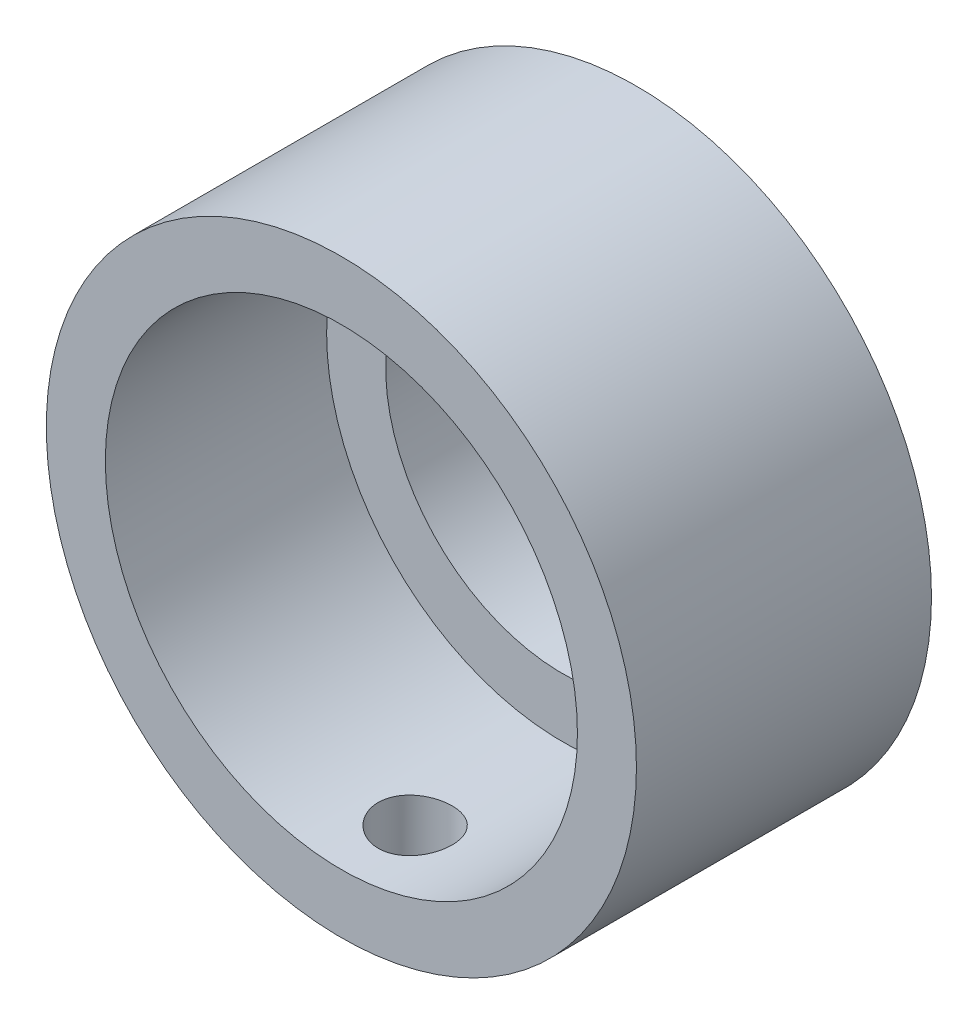
ISO-10303-21;
HEADER;
FILE_DESCRIPTION(('STEP AP214'),'2;1');
FILE_NAME('part.step','',(''),(''),'','','');
FILE_SCHEMA(('AUTOMOTIVE_DESIGN { 1 0 10303 214 1 1 1 1 }'));
ENDSEC;
DATA;
#1=APPLICATION_CONTEXT('core data for automotive mechanical design processes');
#2=APPLICATION_PROTOCOL_DEFINITION('international standard','automotive_design',2000,#1);
#3=PRODUCT_CONTEXT('',#1,'mechanical');
#4=PRODUCT('Part','Part','',(#3));
#5=PRODUCT_RELATED_PRODUCT_CATEGORY('part','',(#4));
#6=PRODUCT_DEFINITION_FORMATION('','',#4);
#7=PRODUCT_DEFINITION_CONTEXT('part definition',#1,'design');
#8=PRODUCT_DEFINITION('design','',#6,#7);
#9=PRODUCT_DEFINITION_SHAPE('','',#8);
#10=(LENGTH_UNIT() NAMED_UNIT(*) SI_UNIT(.MILLI.,.METRE.));
#11=(NAMED_UNIT(*) PLANE_ANGLE_UNIT() SI_UNIT($,.RADIAN.));
#12=(NAMED_UNIT(*) SI_UNIT($,.STERADIAN.) SOLID_ANGLE_UNIT());
#13=UNCERTAINTY_MEASURE_WITH_UNIT(LENGTH_MEASURE(1.E-05),#10,'distance_accuracy_value','');
#14=(GEOMETRIC_REPRESENTATION_CONTEXT(3) GLOBAL_UNCERTAINTY_ASSIGNED_CONTEXT((#13)) GLOBAL_UNIT_ASSIGNED_CONTEXT((#10,
#11,#12)) REPRESENTATION_CONTEXT('',''));
#15=CARTESIAN_POINT('',(0.,0.,0.));
#16=DIRECTION('',(0.,0.,1.));
#17=DIRECTION('',(1.,0.,0.));
#18=AXIS2_PLACEMENT_3D('',#15,#16,#17);
#19=CARTESIAN_POINT('',(0.,4.,0.));
#20=DIRECTION('',(0.,0.,-1.));
#21=DIRECTION('',(-1.,0.,0.));
#22=AXIS2_PLACEMENT_3D('',#19,#20,#21);
#23=PLANE('',#22);
#24=CARTESIAN_POINT('',(0.,0.,0.));
#25=DIRECTION('',(0.,0.,1.));
#26=DIRECTION('',(1.,0.,0.));
#27=AXIS2_PLACEMENT_3D('',#24,#25,#26);
#28=CIRCLE('',#27,3.2);
#29=CARTESIAN_POINT('',(3.2,0.,0.));
#30=VERTEX_POINT('',#29);
#31=EDGE_CURVE('E10',#30,#30,#28,.T.);
#32=ORIENTED_EDGE('',*,*,#31,.F.);
#33=EDGE_LOOP('',(#32));
#34=FACE_BOUND('',#33,.T.);
#35=CARTESIAN_POINT('',(0.,0.,0.));
#36=DIRECTION('',(0.,0.,1.));
#37=DIRECTION('',(1.,0.,0.));
#38=AXIS2_PLACEMENT_3D('',#35,#36,#37);
#39=CIRCLE('',#38,4.);
#40=CARTESIAN_POINT('',(4.,0.,0.));
#41=VERTEX_POINT('',#40);
#42=EDGE_CURVE('E63',#41,#41,#39,.T.);
#43=ORIENTED_EDGE('',*,*,#42,.T.);
#44=EDGE_LOOP('',(#43));
#45=FACE_BOUND('',#44,.T.);
#46=ADVANCED_FACE('F36',(#34,#45),#23,.F.);
#47=CARTESIAN_POINT('',(0.,0.,0.));
#48=DIRECTION('',(0.,0.,1.));
#49=DIRECTION('',(1.,0.,0.));
#50=AXIS2_PLACEMENT_3D('',#47,#48,#49);
#51=CYLINDRICAL_SURFACE('',#50,3.2);
#52=CARTESIAN_POINT('',(0.,-3.2,-0.5));
#53=CARTESIAN_POINT('',(-0.0279030194542066,-3.19999954038897,-0.500001139654303));
#54=CARTESIAN_POINT('',(-0.0558218809731407,-3.19963122497148,-0.502343622754711));
#55=CARTESIAN_POINT('',(-0.11087826299562,-3.19819739619519,-0.511648738255351));
#56=CARTESIAN_POINT('',(-0.138015012264663,-3.19713121768945,-0.518615778500702));
#57=CARTESIAN_POINT('',(-0.190702507609481,-3.19442139433155,-0.536955932561324));
#58=CARTESIAN_POINT('',(-0.21625447045798,-3.19277819912634,-0.54832561627232));
#59=CARTESIAN_POINT('',(-0.26508425020892,-3.18909558807631,-0.575139709028322));
#60=CARTESIAN_POINT('',(-0.288362362073662,-3.18705622372511,-0.590583588607189));
#61=CARTESIAN_POINT('',(-0.332183982330323,-3.18278853682871,-0.625246609670791));
#62=CARTESIAN_POINT('',(-0.352705495828529,-3.18055890278467,-0.64449339897805));
#63=CARTESIAN_POINT('',(-0.390241537645646,-3.17617215226057,-0.686156389653778));
#64=CARTESIAN_POINT('',(-0.407255857308384,-3.1740150401015,-0.70857277946004));
#65=CARTESIAN_POINT('',(-0.437381088657768,-3.17000485625489,-0.756087654268745));
#66=CARTESIAN_POINT('',(-0.450470547115983,-3.16815347957221,-0.781199896472359));
#67=CARTESIAN_POINT('',(-0.47223736319413,-3.16498240348473,-0.833300282171561));
#68=CARTESIAN_POINT('',(-0.480914982020127,-3.16366267260443,-0.860288314502112));
#69=CARTESIAN_POINT('',(-0.493543118644334,-3.16171726902207,-0.915142180228757));
#70=CARTESIAN_POINT('',(-0.497531410974991,-3.16108605306473,-0.94299911716376));
#71=CARTESIAN_POINT('',(-0.500784739515243,-3.16057234214355,-0.998993437778529));
#72=CARTESIAN_POINT('',(-0.500050069720932,-3.16068980057605,-1.02713080389321));
#73=CARTESIAN_POINT('',(-0.49390916161778,-3.16165510091041,-1.08261940637054));
#74=CARTESIAN_POINT('',(-0.488545125919386,-3.16249634436989,-1.10997544467063));
#75=CARTESIAN_POINT('',(-0.473363875667503,-3.16480411269095,-1.16339440127186));
#76=CARTESIAN_POINT('',(-0.463546525368264,-3.16627065661282,-1.18945728012811));
#77=CARTESIAN_POINT('',(-0.439693833898769,-3.16967101370924,-1.23967774253543));
#78=CARTESIAN_POINT('',(-0.425640744631098,-3.17160678617449,-1.26382675835461));
#79=CARTESIAN_POINT('',(-0.393728116293274,-3.1757260923002,-1.30943990713711));
#80=CARTESIAN_POINT('',(-0.375868306506033,-3.17790964357642,-1.33090384897749));
#81=CARTESIAN_POINT('',(-0.336618177644666,-3.18230757249779,-1.37078204932666));
#82=CARTESIAN_POINT('',(-0.315191601121078,-3.18452202727118,-1.38916063165389));
#83=CARTESIAN_POINT('',(-0.269539389475872,-3.18871025069565,-1.42206662912798));
#84=CARTESIAN_POINT('',(-0.245313740136264,-3.19068401812405,-1.43659402471137));
#85=CARTESIAN_POINT('',(-0.194719185411298,-3.19417079805407,-1.46138761468448));
#86=CARTESIAN_POINT('',(-0.168348837248092,-3.19568349708387,-1.4716509117066));
#87=CARTESIAN_POINT('',(-0.114229906939352,-3.19807512000135,-1.48759319348945));
#88=CARTESIAN_POINT('',(-0.0864814261374402,-3.19895409041795,-1.4932725148133));
#89=CARTESIAN_POINT('',(-0.0307016673527471,-3.19997302345456,-1.49983785529004));
#90=CARTESIAN_POINT('',(-0.00267629230174048,-3.20012054358572,-1.50077289579524));
#91=CARTESIAN_POINT('',(0.0531309092823283,-3.19968057298254,-1.4979534589328));
#92=CARTESIAN_POINT('',(0.0809127439850311,-3.19909310699929,-1.49419913948218));
#93=CARTESIAN_POINT('',(0.135294689253141,-3.19725384738644,-1.48214832246396));
#94=CARTESIAN_POINT('',(0.161900252411208,-3.19600556843077,-1.47387584834645));
#95=CARTESIAN_POINT('',(0.213346813571325,-3.19298415136712,-1.45304898112024));
#96=CARTESIAN_POINT('',(0.238187722607881,-3.19121098682014,-1.44049437231147));
#97=CARTESIAN_POINT('',(0.285614440450082,-3.18731794548189,-1.41134560177468));
#98=CARTESIAN_POINT('',(0.308181024756745,-3.18519545732684,-1.3947205159819));
#99=CARTESIAN_POINT('',(0.350221393015612,-3.18084776092887,-1.35794558281844));
#100=CARTESIAN_POINT('',(0.369694980894036,-3.17862254618535,-1.33779551215903));
#101=CARTESIAN_POINT('',(0.405176161553381,-3.1742960550733,-1.29432376055656));
#102=CARTESIAN_POINT('',(0.421150797168252,-3.17219608238161,-1.27097503057553));
#103=CARTESIAN_POINT('',(0.448951135453281,-3.16838138561166,-1.22189678526773));
#104=CARTESIAN_POINT('',(0.460776957556209,-3.16666665044399,-1.1961673385021));
#105=CARTESIAN_POINT('',(0.479893543889989,-3.16382614270471,-1.14315407185716));
#106=CARTESIAN_POINT('',(0.487201309895824,-3.16269816469792,-1.11587650624688));
#107=CARTESIAN_POINT('',(0.497128244081071,-3.16115314056159,-1.0604621712672));
#108=CARTESIAN_POINT('',(0.499747766169995,-3.16073604076888,-1.0323254669162));
#109=CARTESIAN_POINT('',(0.500214905381512,-3.16066211608977,-0.976320256818505));
#110=CARTESIAN_POINT('',(0.49811436109685,-3.1609970320858,-0.9484521806133));
#111=CARTESIAN_POINT('',(0.489312446511802,-3.16237139788366,-0.893470940571143));
#112=CARTESIAN_POINT('',(0.482611086173923,-3.1634108461599,-0.866357775099657));
#113=CARTESIAN_POINT('',(0.464816659783703,-3.16607417770981,-0.813672434671896));
#114=CARTESIAN_POINT('',(0.453727523477162,-3.16769753790682,-0.788098904348318));
#115=CARTESIAN_POINT('',(0.427477537092834,-3.17134636809479,-0.739166877264745));
#116=CARTESIAN_POINT('',(0.412316525641772,-3.17337185402165,-0.715808468342314));
#117=CARTESIAN_POINT('',(0.378166016278159,-3.17762313618452,-0.671706891174634));
#118=CARTESIAN_POINT('',(0.359138214189537,-3.17985080232058,-0.650993560677233));
#119=CARTESIAN_POINT('',(0.317875189276408,-3.18424008728147,-0.613035752722653));
#120=CARTESIAN_POINT('',(0.295639224156865,-3.18640169068025,-0.595792080281625));
#121=CARTESIAN_POINT('',(0.248433371768683,-3.1904302049134,-0.565169755393687));
#122=CARTESIAN_POINT('',(0.223447874428476,-3.19229526886054,-0.551814925448077));
#123=CARTESIAN_POINT('',(0.171570376471557,-3.19550251967776,-0.529511800761411));
#124=CARTESIAN_POINT('',(0.144680355316352,-3.19684524028424,-0.520559005488322));
#125=CARTESIAN_POINT('',(0.0980628479823188,-3.19855489172976,-0.509313395781883));
#126=CARTESIAN_POINT('',(0.078621115130325,-3.19909398325224,-0.5058263018742));
#127=CARTESIAN_POINT('',(0.0394555595701165,-3.19981669739524,-0.501169217324185));
#128=CARTESIAN_POINT('',(0.0197317408338238,-3.20000032501593,-0.499999194088533));
#129=CARTESIAN_POINT('',(0.,-3.2,-0.5));
#130=B_SPLINE_CURVE_WITH_KNOTS('',3,(#52,#53,#54,#55,#56,#57,#58,#59,#60,#61,#62,#63,#64,#65,
#66,#67,#68,#69,#70,#71,#72,#73,#74,#75,#76,#77,#78,#79,#80,#81,#82,#83,#84,#85,#86,#87,#88,#89,
#90,#91,#92,#93,#94,#95,#96,#97,#98,#99,#100,#101,#102,#103,#104,#105,#106,#107,#108,#109,#110,
#111,#112,#113,#114,#115,#116,#117,#118,#119,#120,#121,#122,#123,#124,#125,#126,#127,#128,#129),
.UNSPECIFIED.,.T.,.F.,(4,2,2,2,2,2,2,2,2,2,2,2,2,2,2,2,2,2,2,2,2,2,2,2,2,2,2,2,2,2,2,2,2,2,2,2,
2,2,4),(0.,0.0836369480954981,0.167353728505603,0.251005415888205,0.33464623758406,
0.418919136304398,0.503197047290843,0.587927557211518,0.672653050018477,0.756691262269989,
0.84072424334109,0.92399915204516,1.0072765993021,1.09090795480469,1.17454525978414,
1.25909146466873,1.34363809902765,1.42824208750913,1.51283986365973,1.59656170801183,
1.68028073305671,1.76355888951313,1.84684124148406,1.93077708293934,2.01471824320283,
2.09941896049918,2.18411723929796,2.26849482079026,2.35286603245859,2.43631516319738,
2.51976411323779,2.60313849393324,2.6865161793427,2.77076402463108,2.8550313942846,
2.93980460839968,3.02449097131256,3.08363603270308,3.14278026211742),.UNSPECIFIED.);
#131=CARTESIAN_POINT('',(0.,-3.2,-0.5));
#132=VERTEX_POINT('',#131);
#133=EDGE_CURVE('E66',#132,#132,#130,.T.);
#134=ORIENTED_EDGE('',*,*,#133,.T.);
#135=EDGE_LOOP('',(#134));
#136=FACE_BOUND('',#135,.T.);
#137=CARTESIAN_POINT('',(0.,0.,-3.));
#138=DIRECTION('',(0.,0.,1.));
#139=DIRECTION('',(1.,0.,0.));
#140=AXIS2_PLACEMENT_3D('',#137,#138,#139);
#141=CIRCLE('',#140,3.2);
#142=CARTESIAN_POINT('',(3.2,0.,-3.));
#143=VERTEX_POINT('',#142);
#144=EDGE_CURVE('E48',#143,#143,#141,.T.);
#145=ORIENTED_EDGE('',*,*,#144,.F.);
#146=EDGE_LOOP('',(#145));
#147=FACE_BOUND('',#146,.T.);
#148=ORIENTED_EDGE('',*,*,#31,.T.);
#149=EDGE_LOOP('',(#148));
#150=FACE_BOUND('',#149,.T.);
#151=ADVANCED_FACE('F71',(#136,#147,#150),#51,.F.);
#152=CARTESIAN_POINT('',(0.,3.2,-3.));
#153=DIRECTION('',(0.,0.,-1.));
#154=DIRECTION('',(-1.,0.,0.));
#155=AXIS2_PLACEMENT_3D('',#152,#153,#154);
#156=PLANE('',#155);
#157=CARTESIAN_POINT('',(0.,0.,-3.));
#158=DIRECTION('',(0.,0.,1.));
#159=DIRECTION('',(1.,0.,0.));
#160=AXIS2_PLACEMENT_3D('',#157,#158,#159);
#161=CIRCLE('',#160,2.4);
#162=CARTESIAN_POINT('',(2.4,0.,-3.));
#163=VERTEX_POINT('',#162);
#164=EDGE_CURVE('E52',#163,#163,#161,.T.);
#165=ORIENTED_EDGE('',*,*,#164,.F.);
#166=EDGE_LOOP('',(#165));
#167=FACE_BOUND('',#166,.T.);
#168=ORIENTED_EDGE('',*,*,#144,.T.);
#169=EDGE_LOOP('',(#168));
#170=FACE_BOUND('',#169,.T.);
#171=ADVANCED_FACE('F90',(#167,#170),#156,.F.);
#172=CARTESIAN_POINT('',(0.,0.,0.));
#173=DIRECTION('',(0.,0.,1.));
#174=DIRECTION('',(1.,0.,0.));
#175=AXIS2_PLACEMENT_3D('',#172,#173,#174);
#176=CYLINDRICAL_SURFACE('',#175,2.4);
#177=CARTESIAN_POINT('',(0.,0.,-4.));
#178=DIRECTION('',(0.,0.,1.));
#179=DIRECTION('',(1.,0.,0.));
#180=AXIS2_PLACEMENT_3D('',#177,#178,#179);
#181=CIRCLE('',#180,2.4);
#182=CARTESIAN_POINT('',(2.4,0.,-4.));
#183=VERTEX_POINT('',#182);
#184=EDGE_CURVE('E57',#183,#183,#181,.T.);
#185=ORIENTED_EDGE('',*,*,#184,.F.);
#186=EDGE_LOOP('',(#185));
#187=FACE_BOUND('',#186,.T.);
#188=ORIENTED_EDGE('',*,*,#164,.T.);
#189=EDGE_LOOP('',(#188));
#190=FACE_BOUND('',#189,.T.);
#191=ADVANCED_FACE('F87',(#187,#190),#176,.F.);
#192=CARTESIAN_POINT('',(0.,2.4,-4.));
#193=DIRECTION('',(0.,0.,1.));
#194=DIRECTION('',(1.,0.,0.));
#195=AXIS2_PLACEMENT_3D('',#192,#193,#194);
#196=PLANE('',#195);
#197=CARTESIAN_POINT('',(0.,0.,-4.));
#198=DIRECTION('',(0.,0.,1.));
#199=DIRECTION('',(1.,0.,0.));
#200=AXIS2_PLACEMENT_3D('',#197,#198,#199);
#201=CIRCLE('',#200,4.);
#202=CARTESIAN_POINT('',(4.,0.,-4.));
#203=VERTEX_POINT('',#202);
#204=EDGE_CURVE('E60',#203,#203,#201,.T.);
#205=ORIENTED_EDGE('',*,*,#204,.F.);
#206=EDGE_LOOP('',(#205));
#207=FACE_BOUND('',#206,.T.);
#208=ORIENTED_EDGE('',*,*,#184,.T.);
#209=EDGE_LOOP('',(#208));
#210=FACE_BOUND('',#209,.T.);
#211=ADVANCED_FACE('F83',(#207,#210),#196,.F.);
#212=CARTESIAN_POINT('',(0.,0.,0.));
#213=DIRECTION('',(0.,0.,1.));
#214=DIRECTION('',(1.,0.,0.));
#215=AXIS2_PLACEMENT_3D('',#212,#213,#214);
#216=CYLINDRICAL_SURFACE('',#215,4.);
#217=CARTESIAN_POINT('',(0.,-4.,-0.5));
#218=CARTESIAN_POINT('',(0.0279682191111523,-3.99999960979286,-0.500001188187144));
#219=CARTESIAN_POINT('',(0.0559539148605494,-3.9997035691098,-0.502354575833857));
#220=CARTESIAN_POINT('',(0.111146560417951,-3.99855108022272,-0.511705550914159));
#221=CARTESIAN_POINT('',(0.138352666124749,-3.99769404688286,-0.518707987584678));
#222=CARTESIAN_POINT('',(0.191179114962611,-3.99551612208881,-0.537147528782817));
#223=CARTESIAN_POINT('',(0.216800512029228,-3.99419554291108,-0.548581648361971));
#224=CARTESIAN_POINT('',(0.265755894978607,-3.9912374017562,-0.575553456793959));
#225=CARTESIAN_POINT('',(0.289090272311274,-3.98959989416823,-0.591090441706143));
#226=CARTESIAN_POINT('',(0.332942563386263,-3.98618064261265,-0.625918389967918));
#227=CARTESIAN_POINT('',(0.353446072987425,-3.98439822938483,-0.645227425869248));
#228=CARTESIAN_POINT('',(0.390930558711499,-3.9808954520195,-0.687012564707328));
#229=CARTESIAN_POINT('',(0.40791135527845,-3.97917509104854,-0.709488828982649));
#230=CARTESIAN_POINT('',(0.437922032256788,-3.97598461123917,-0.757063995513133));
#231=CARTESIAN_POINT('',(0.450938419188214,-3.97451535435582,-0.782171472313589));
#232=CARTESIAN_POINT('',(0.472564615315023,-3.97200225691537,-0.834237410389472));
#233=CARTESIAN_POINT('',(0.481174591613043,-3.97095840022627,-0.861195801429403));
#234=CARTESIAN_POINT('',(0.493699796004953,-3.96942067920723,-0.916048839117353));
#235=CARTESIAN_POINT('',(0.49763934294634,-3.96892396687349,-0.943937851540839));
#236=CARTESIAN_POINT('',(0.500787109911446,-3.96852805628558,-0.999985252694367));
#237=CARTESIAN_POINT('',(0.499995520200483,-3.96862883400302,-1.02814363054626));
#238=CARTESIAN_POINT('',(0.493723447289581,-3.9694139107395,-1.08376096544976));
#239=CARTESIAN_POINT('',(0.488269752596939,-3.97009487592066,-1.11122299724005));
#240=CARTESIAN_POINT('',(0.47287007663641,-3.97195839951526,-1.1648390042438));
#241=CARTESIAN_POINT('',(0.462924004350381,-3.97314096809145,-1.19099295294281));
#242=CARTESIAN_POINT('',(0.43879311198233,-3.9758782317293,-1.24133359980434));
#243=CARTESIAN_POINT('',(0.424596650741527,-3.97743394642289,-1.2655146600498));
#244=CARTESIAN_POINT('',(0.392376293891384,-3.9807414228612,-1.31116133888265));
#245=CARTESIAN_POINT('',(0.374352223216155,-3.98249319357133,-1.33262683319474));
#246=CARTESIAN_POINT('',(0.334839822150756,-3.98601021978085,-1.37238854214455));
#247=CARTESIAN_POINT('',(0.313328401568003,-3.98777548477378,-1.3906618183532));
#248=CARTESIAN_POINT('',(0.267531433822785,-3.9911092651117,-1.42334177600611));
#249=CARTESIAN_POINT('',(0.24324588026365,-3.99267778000301,-1.4377484485344));
#250=CARTESIAN_POINT('',(0.192572334272696,-3.99544230443716,-1.46228626409278));
#251=CARTESIAN_POINT('',(0.166183639067543,-3.99663818880307,-1.47241597077625));
#252=CARTESIAN_POINT('',(0.112061588086211,-3.99852157156012,-1.48809409870465));
#253=CARTESIAN_POINT('',(0.0843282953261335,-3.99920909375174,-1.49364273442741));
#254=CARTESIAN_POINT('',(0.0285026327826995,-3.99999519282152,-1.49997148485211));
#255=CARTESIAN_POINT('',(0.000413898039721458,-4.00009767228527,-1.50078319847281));
#256=CARTESIAN_POINT('',(-0.0554992072994992,-3.99971267601086,-1.49769845318881));
#257=CARTESIAN_POINT('',(-0.0833235835129413,-3.99922521283642,-1.49380209454968));
#258=CARTESIAN_POINT('',(-0.137824901544304,-3.99771753751338,-1.48143805824512));
#259=CARTESIAN_POINT('',(-0.164505314084941,-3.99669908162774,-1.47298544731947));
#260=CARTESIAN_POINT('',(-0.216069930971681,-3.99424344620039,-1.45176450961742));
#261=CARTESIAN_POINT('',(-0.240954074293063,-3.99280625244125,-1.43899603630171));
#262=CARTESIAN_POINT('',(-0.288360904137485,-3.98966364582022,-1.40942937249851));
#263=CARTESIAN_POINT('',(-0.310870751988764,-3.98795688808502,-1.39261074203887));
#264=CARTESIAN_POINT('',(-0.352759397925264,-3.98447028465131,-1.35545010049316));
#265=CARTESIAN_POINT('',(-0.372138071667371,-3.9826904360538,-1.3351079495498));
#266=CARTESIAN_POINT('',(-0.407326391763603,-3.97924621092517,-1.29133851664857));
#267=CARTESIAN_POINT('',(-0.423115092113587,-3.97758254944265,-1.26789433073792));
#268=CARTESIAN_POINT('',(-0.450530577888701,-3.9745708220743,-1.21866835102906));
#269=CARTESIAN_POINT('',(-0.462157446745674,-3.97322274986205,-1.1928866041047));
#270=CARTESIAN_POINT('',(-0.480885315773308,-3.97099970078599,-1.13978493617048));
#271=CARTESIAN_POINT('',(-0.487998125491422,-3.97012349036958,-1.11246923399041));
#272=CARTESIAN_POINT('',(-0.497533998773569,-3.96893983181491,-1.05701950324387));
#273=CARTESIAN_POINT('',(-0.499957280507153,-3.96863235721755,-1.0288855128082));
#274=CARTESIAN_POINT('',(-0.500041307216967,-3.96862175396491,-0.972806214159064));
#275=CARTESIAN_POINT('',(-0.497734959539855,-3.96891444950391,-0.944860950333622));
#276=CARTESIAN_POINT('',(-0.488494880969865,-3.9700622290744,-0.889758574130984));
#277=CARTESIAN_POINT('',(-0.481561149581154,-3.97091731316616,-0.862601461838241));
#278=CARTESIAN_POINT('',(-0.463273414737931,-3.9730922315491,-0.80985060864672));
#279=CARTESIAN_POINT('',(-0.451920996194187,-3.97441189918557,-0.784256310995637));
#280=CARTESIAN_POINT('',(-0.425121380430062,-3.97736756648964,-0.735330669190337));
#281=CARTESIAN_POINT('',(-0.409674131901918,-3.97900357012082,-0.711999353396034));
#282=CARTESIAN_POINT('',(-0.375001266253167,-3.98242120950447,-0.668093754931905));
#283=CARTESIAN_POINT('',(-0.355751125154991,-3.98420374416807,-0.647538907809004));
#284=CARTESIAN_POINT('',(-0.314070045393676,-3.9877056631858,-0.609938634966405));
#285=CARTESIAN_POINT('',(-0.291638357828313,-3.98942503255118,-0.592894037845138));
#286=CARTESIAN_POINT('',(-0.244133124170842,-3.99261411317349,-0.562742928578941));
#287=CARTESIAN_POINT('',(-0.219049855919234,-3.9940828501566,-0.549651638820149));
#288=CARTESIAN_POINT('',(-0.167036580460256,-3.99659529815345,-0.527885751416744));
#289=CARTESIAN_POINT('',(-0.140108616174047,-3.99763947073915,-0.519206354729308));
#290=CARTESIAN_POINT('',(-0.0942011543935849,-3.99893344065549,-0.508588132365739));
#291=CARTESIAN_POINT('',(-0.0755111327033841,-3.99933145179091,-0.505372211603587));
#292=CARTESIAN_POINT('',(-0.0378834126424869,-3.99986486265838,-0.501077750861355));
#293=CARTESIAN_POINT('',(-0.0189457160992054,-4.00000026432694,-0.49999919512014));
#294=CARTESIAN_POINT('',(0.,-4.,-0.5));
#295=B_SPLINE_CURVE_WITH_KNOTS('',3,(#217,#218,#219,#220,#221,#222,#223,#224,#225,#226,#227,
#228,#229,#230,#231,#232,#233,#234,#235,#236,#237,#238,#239,#240,#241,#242,#243,#244,#245,#246,
#247,#248,#249,#250,#251,#252,#253,#254,#255,#256,#257,#258,#259,#260,#261,#262,#263,#264,#265,
#266,#267,#268,#269,#270,#271,#272,#273,#274,#275,#276,#277,#278,#279,#280,#281,#282,#283,#284,
#285,#286,#287,#288,#289,#290,#291,#292,#293,#294),.UNSPECIFIED.,.T.,.F.,(4,2,2,2,2,2,2,2,2,2,2,
2,2,2,2,2,2,2,2,2,2,2,2,2,2,2,2,2,2,2,2,2,2,2,2,2,2,2,4),(0.,0.0838354545552494,
0.167758492188685,0.251625101636354,0.335477331182146,0.419741626403686,0.504010215600021,
0.588562500637739,0.673111578993614,0.757218450572642,0.841321939769328,0.924945392883384,
1.00857054033248,1.09242685257107,1.17628700102728,1.26072695627283,1.34516710622623,
1.42963559146321,1.51410012180756,1.59800055878384,1.68189920900386,1.76552210778679,
1.84914784615789,1.93320480585684,2.01726510275018,2.10180394301515,2.18634108844308,
2.27065614856185,2.35496728602125,2.43869380240443,2.5224203277591,2.60611684941297,
2.68981441982453,2.77407047538366,2.85834639694002,2.94294280607371,3.02744699736807,
3.08423768637526,3.14102795660087),.UNSPECIFIED.);
#296=CARTESIAN_POINT('',(0.,-4.,-0.5));
#297=VERTEX_POINT('',#296);
#298=EDGE_CURVE('E39',#297,#297,#295,.T.);
#299=ORIENTED_EDGE('',*,*,#298,.T.);
#300=EDGE_LOOP('',(#299));
#301=FACE_BOUND('',#300,.T.);
#302=ORIENTED_EDGE('',*,*,#42,.F.);
#303=EDGE_LOOP('',(#302));
#304=FACE_BOUND('',#303,.T.);
#305=ORIENTED_EDGE('',*,*,#204,.T.);
#306=EDGE_LOOP('',(#305));
#307=FACE_BOUND('',#306,.T.);
#308=ADVANCED_FACE('F77',(#301,#304,#307),#216,.T.);
#309=CARTESIAN_POINT('',(0.,-10.,-1.));
#310=DIRECTION('',(0.,1.,0.));
#311=DIRECTION('',(0.,0.,1.));
#312=AXIS2_PLACEMENT_3D('',#309,#310,#311);
#313=CYLINDRICAL_SURFACE('',#312,0.5);
#314=ORIENTED_EDGE('',*,*,#298,.F.);
#315=EDGE_LOOP('',(#314));
#316=FACE_BOUND('',#315,.T.);
#317=ORIENTED_EDGE('',*,*,#133,.F.);
#318=EDGE_LOOP('',(#317));
#319=FACE_BOUND('',#318,.T.);
#320=ADVANCED_FACE('F74',(#316,#319),#313,.F.);
#321=CLOSED_SHELL('',(#46,#151,#171,#191,#211,#308,#320));
#322=MANIFOLD_SOLID_BREP('B2',#321);
#323=ADVANCED_BREP_SHAPE_REPRESENTATION('',(#18,#322),#14);
#324=SHAPE_DEFINITION_REPRESENTATION(#9,#323);
ENDSEC;
END-ISO-10303-21;
